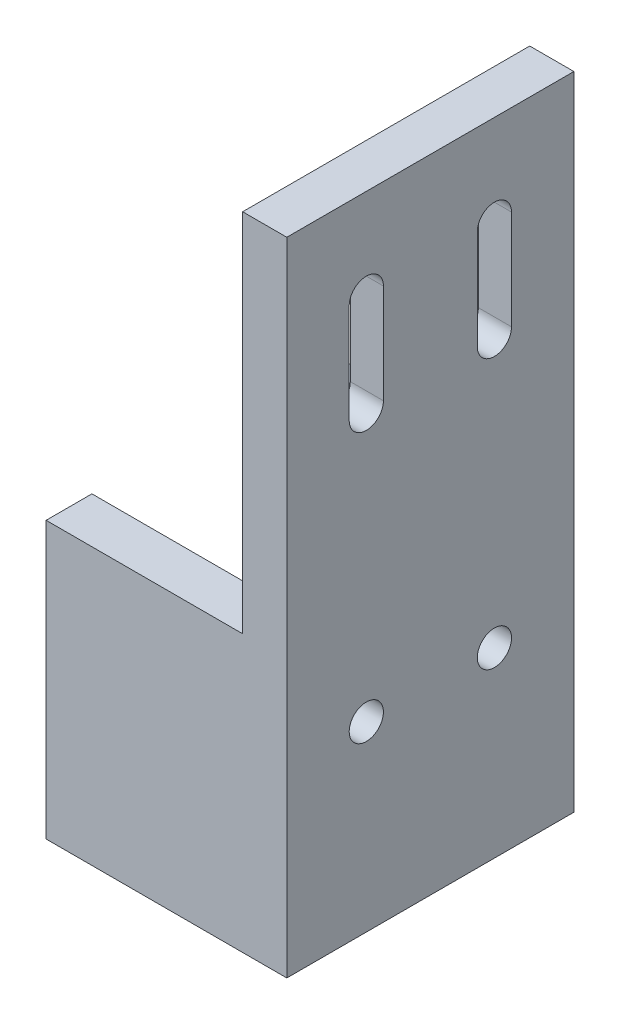
ISO-10303-21;
HEADER;
FILE_DESCRIPTION(('STEP AP214'),'2;1');
FILE_NAME('part.step','',(''),(''),'','','');
FILE_SCHEMA(('AUTOMOTIVE_DESIGN { 1 0 10303 214 1 1 1 1 }'));
ENDSEC;
DATA;
#1=APPLICATION_CONTEXT('core data for automotive mechanical design processes');
#2=APPLICATION_PROTOCOL_DEFINITION('international standard','automotive_design',2000,#1);
#3=PRODUCT_CONTEXT('',#1,'mechanical');
#4=PRODUCT('Part','Part','',(#3));
#5=PRODUCT_RELATED_PRODUCT_CATEGORY('part','',(#4));
#6=PRODUCT_DEFINITION_FORMATION('','',#4);
#7=PRODUCT_DEFINITION_CONTEXT('part definition',#1,'design');
#8=PRODUCT_DEFINITION('design','',#6,#7);
#9=PRODUCT_DEFINITION_SHAPE('','',#8);
#10=(LENGTH_UNIT() NAMED_UNIT(*) SI_UNIT(.MILLI.,.METRE.));
#11=(NAMED_UNIT(*) PLANE_ANGLE_UNIT() SI_UNIT($,.RADIAN.));
#12=(NAMED_UNIT(*) SI_UNIT($,.STERADIAN.) SOLID_ANGLE_UNIT());
#13=UNCERTAINTY_MEASURE_WITH_UNIT(LENGTH_MEASURE(1.E-05),#10,'distance_accuracy_value','');
#14=(GEOMETRIC_REPRESENTATION_CONTEXT(3) GLOBAL_UNCERTAINTY_ASSIGNED_CONTEXT((#13)) GLOBAL_UNIT_ASSIGNED_CONTEXT((#10,
#11,#12)) REPRESENTATION_CONTEXT('',''));
#15=CARTESIAN_POINT('',(0.,0.,0.));
#16=DIRECTION('',(0.,0.,1.));
#17=DIRECTION('',(1.,0.,0.));
#18=AXIS2_PLACEMENT_3D('',#15,#16,#17);
#19=CARTESIAN_POINT('',(0.,58.1,26.));
#20=DIRECTION('',(1.,0.,0.));
#21=DIRECTION('',(0.,1.,0.));
#22=AXIS2_PLACEMENT_3D('',#19,#20,#21);
#23=PLANE('',#22);
#24=DIRECTION('',(0.,-1.,0.));
#25=VECTOR('',#24,1.);
#26=CARTESIAN_POINT('',(0.,49.9,4.));
#27=LINE('',#26,#25);
#28=CARTESIAN_POINT('',(0.,49.9,4.));
#29=VERTEX_POINT('',#28);
#30=CARTESIAN_POINT('',(0.,40.9,4.));
#31=VERTEX_POINT('',#30);
#32=EDGE_CURVE('E380',#29,#31,#27,.T.);
#33=ORIENTED_EDGE('',*,*,#32,.F.);
#34=CARTESIAN_POINT('',(0.,49.9,7.2));
#35=DIRECTION('',(-1.,0.,0.));
#36=DIRECTION('',(0.,-1.,0.));
#37=AXIS2_PLACEMENT_3D('',#34,#35,#36);
#38=CIRCLE('',#37,3.2);
#39=CARTESIAN_POINT('',(0.,49.9,10.4));
#40=VERTEX_POINT('',#39);
#41=EDGE_CURVE('E346',#40,#29,#38,.T.);
#42=ORIENTED_EDGE('',*,*,#41,.F.);
#43=DIRECTION('',(0.,1.,0.));
#44=VECTOR('',#43,1.);
#45=CARTESIAN_POINT('',(0.,49.9,10.4));
#46=LINE('',#45,#44);
#47=CARTESIAN_POINT('',(0.,40.9,10.4));
#48=VERTEX_POINT('',#47);
#49=EDGE_CURVE('E373',#48,#40,#46,.T.);
#50=ORIENTED_EDGE('',*,*,#49,.F.);
#51=CARTESIAN_POINT('',(0.,40.9,7.2));
#52=DIRECTION('',(-1.,0.,0.));
#53=DIRECTION('',(0.,-1.,0.));
#54=AXIS2_PLACEMENT_3D('',#51,#52,#53);
#55=CIRCLE('',#54,3.2);
#56=EDGE_CURVE('E377',#31,#48,#55,.T.);
#57=ORIENTED_EDGE('',*,*,#56,.F.);
#58=EDGE_LOOP('',(#33,#42,#50,#57));
#59=FACE_BOUND('',#58,.T.);
#60=DIRECTION('',(0.,-1.,0.));
#61=VECTOR('',#60,1.);
#62=CARTESIAN_POINT('',(0.,49.9,15.6));
#63=LINE('',#62,#61);
#64=CARTESIAN_POINT('',(0.,49.9,15.6));
#65=VERTEX_POINT('',#64);
#66=CARTESIAN_POINT('',(0.,40.9,15.6));
#67=VERTEX_POINT('',#66);
#68=EDGE_CURVE('E347',#65,#67,#63,.T.);
#69=ORIENTED_EDGE('',*,*,#68,.F.);
#70=CARTESIAN_POINT('',(0.,49.9,18.8));
#71=DIRECTION('',(-1.,0.,0.));
#72=DIRECTION('',(0.,-1.,0.));
#73=AXIS2_PLACEMENT_3D('',#70,#71,#72);
#74=CIRCLE('',#73,3.20000000000001);
#75=CARTESIAN_POINT('',(0.,49.9,22.));
#76=VERTEX_POINT('',#75);
#77=EDGE_CURVE('E344',#76,#65,#74,.T.);
#78=ORIENTED_EDGE('',*,*,#77,.F.);
#79=DIRECTION('',(0.,1.,0.));
#80=VECTOR('',#79,1.);
#81=CARTESIAN_POINT('',(0.,49.9,22.));
#82=LINE('',#81,#80);
#83=CARTESIAN_POINT('',(0.,40.9,22.));
#84=VERTEX_POINT('',#83);
#85=EDGE_CURVE('E333',#84,#76,#82,.T.);
#86=ORIENTED_EDGE('',*,*,#85,.F.);
#87=CARTESIAN_POINT('',(0.,40.9,18.8));
#88=DIRECTION('',(-1.,0.,0.));
#89=DIRECTION('',(0.,-1.,0.));
#90=AXIS2_PLACEMENT_3D('',#87,#88,#89);
#91=CIRCLE('',#90,3.2);
#92=EDGE_CURVE('E350',#67,#84,#91,.T.);
#93=ORIENTED_EDGE('',*,*,#92,.F.);
#94=EDGE_LOOP('',(#69,#78,#86,#93));
#95=FACE_BOUND('',#94,.T.);
#96=CARTESIAN_POINT('',(0.,16.5,7.2));
#97=DIRECTION('',(-1.,0.,0.));
#98=DIRECTION('',(0.,-1.,0.));
#99=AXIS2_PLACEMENT_3D('',#96,#97,#98);
#100=CIRCLE('',#99,1.55);
#101=CARTESIAN_POINT('',(0.,14.95,7.2));
#102=VERTEX_POINT('',#101);
#103=EDGE_CURVE('E285',#102,#102,#100,.T.);
#104=ORIENTED_EDGE('',*,*,#103,.F.);
#105=EDGE_LOOP('',(#104));
#106=FACE_BOUND('',#105,.T.);
#107=CARTESIAN_POINT('',(0.,16.5,18.8));
#108=DIRECTION('',(-1.,0.,0.));
#109=DIRECTION('',(0.,-1.,0.));
#110=AXIS2_PLACEMENT_3D('',#107,#108,#109);
#111=CIRCLE('',#110,1.55);
#112=CARTESIAN_POINT('',(0.,14.95,18.8));
#113=VERTEX_POINT('',#112);
#114=EDGE_CURVE('E286',#113,#113,#111,.T.);
#115=ORIENTED_EDGE('',*,*,#114,.F.);
#116=EDGE_LOOP('',(#115));
#117=FACE_BOUND('',#116,.T.);
#118=DIRECTION('',(0.,0.,-1.));
#119=VECTOR('',#118,1.);
#120=CARTESIAN_POINT('',(0.,25.,26.));
#121=LINE('',#120,#119);
#122=CARTESIAN_POINT('',(0.,25.,26.));
#123=VERTEX_POINT('',#122);
#124=CARTESIAN_POINT('',(0.,25.,21.85));
#125=VERTEX_POINT('',#124);
#126=EDGE_CURVE('E221',#123,#125,#121,.T.);
#127=ORIENTED_EDGE('',*,*,#126,.F.);
#128=DIRECTION('',(0.,-1.,0.));
#129=VECTOR('',#128,1.);
#130=CARTESIAN_POINT('',(0.,58.1,26.));
#131=LINE('',#130,#129);
#132=CARTESIAN_POINT('',(0.,58.1,26.));
#133=VERTEX_POINT('',#132);
#134=EDGE_CURVE('E244',#133,#123,#131,.T.);
#135=ORIENTED_EDGE('',*,*,#134,.F.);
#136=DIRECTION('',(0.,0.,-1.));
#137=VECTOR('',#136,1.);
#138=CARTESIAN_POINT('',(0.,58.1,26.));
#139=LINE('',#138,#137);
#140=CARTESIAN_POINT('',(0.,58.1,0.));
#141=VERTEX_POINT('',#140);
#142=EDGE_CURVE('E239',#133,#141,#139,.T.);
#143=ORIENTED_EDGE('',*,*,#142,.T.);
#144=DIRECTION('',(0.,-1.,0.));
#145=VECTOR('',#144,1.);
#146=CARTESIAN_POINT('',(0.,58.1,0.));
#147=LINE('',#146,#145);
#148=CARTESIAN_POINT('',(0.,25.,0.));
#149=VERTEX_POINT('',#148);
#150=EDGE_CURVE('E60',#141,#149,#147,.T.);
#151=ORIENTED_EDGE('',*,*,#150,.T.);
#152=DIRECTION('',(0.,0.,-1.));
#153=VECTOR('',#152,1.);
#154=CARTESIAN_POINT('',(0.,25.,0.));
#155=LINE('',#154,#153);
#156=CARTESIAN_POINT('',(0.,25.,4.15));
#157=VERTEX_POINT('',#156);
#158=EDGE_CURVE('E402',#157,#149,#155,.T.);
#159=ORIENTED_EDGE('',*,*,#158,.F.);
#160=DIRECTION('',(0.,1.,0.));
#161=VECTOR('',#160,1.);
#162=CARTESIAN_POINT('',(0.,0.,4.15));
#163=LINE('',#162,#161);
#164=CARTESIAN_POINT('',(0.,0.,4.15000000000001));
#165=VERTEX_POINT('',#164);
#166=EDGE_CURVE('E229',#165,#157,#163,.T.);
#167=ORIENTED_EDGE('',*,*,#166,.F.);
#168=DIRECTION('',(0.,0.,-1.));
#169=VECTOR('',#168,1.);
#170=CARTESIAN_POINT('',(0.,0.,26.));
#171=LINE('',#170,#169);
#172=CARTESIAN_POINT('',(0.,0.,21.85));
#173=VERTEX_POINT('',#172);
#174=EDGE_CURVE('E52',#173,#165,#171,.T.);
#175=ORIENTED_EDGE('',*,*,#174,.F.);
#176=DIRECTION('',(0.,-1.,0.));
#177=VECTOR('',#176,1.);
#178=CARTESIAN_POINT('',(0.,0.,21.85));
#179=LINE('',#178,#177);
#180=EDGE_CURVE('E213',#125,#173,#179,.T.);
#181=ORIENTED_EDGE('',*,*,#180,.F.);
#182=EDGE_LOOP('',(#127,#135,#143,#151,#159,#167,#175,#181));
#183=FACE_BOUND('',#182,.T.);
#184=ADVANCED_FACE('F38',(#59,#95,#106,#117,#183),#23,.F.);
#185=CARTESIAN_POINT('',(4.,40.9,7.2));
#186=DIRECTION('',(-1.,0.,0.));
#187=DIRECTION('',(0.,-1.,0.));
#188=AXIS2_PLACEMENT_3D('',#185,#186,#187);
#189=CYLINDRICAL_SURFACE('',#188,1.55);
#190=CARTESIAN_POINT('',(0.999999999999994,40.9,7.2));
#191=DIRECTION('',(-1.,0.,0.));
#192=DIRECTION('',(0.,-1.,0.));
#193=AXIS2_PLACEMENT_3D('',#190,#191,#192);
#194=CIRCLE('',#193,1.55);
#195=CARTESIAN_POINT('',(0.999999999999994,40.9,8.75));
#196=VERTEX_POINT('',#195);
#197=CARTESIAN_POINT('',(0.999999999999994,40.9,5.65));
#198=VERTEX_POINT('',#197);
#199=EDGE_CURVE('E315',#196,#198,#194,.F.);
#200=ORIENTED_EDGE('',*,*,#199,.F.);
#201=DIRECTION('',(-1.,0.,0.));
#202=VECTOR('',#201,1.);
#203=CARTESIAN_POINT('',(4.,40.9,8.75));
#204=LINE('',#203,#202);
#205=CARTESIAN_POINT('',(4.,40.9,8.75));
#206=VERTEX_POINT('',#205);
#207=EDGE_CURVE('E258',#206,#196,#204,.T.);
#208=ORIENTED_EDGE('',*,*,#207,.F.);
#209=CARTESIAN_POINT('',(4.,40.9,7.2));
#210=DIRECTION('',(-1.,0.,0.));
#211=DIRECTION('',(0.,-1.,0.));
#212=AXIS2_PLACEMENT_3D('',#209,#210,#211);
#213=CIRCLE('',#212,1.55);
#214=CARTESIAN_POINT('',(4.,40.9,5.65));
#215=VERTEX_POINT('',#214);
#216=EDGE_CURVE('E278',#215,#206,#213,.T.);
#217=ORIENTED_EDGE('',*,*,#216,.F.);
#218=DIRECTION('',(-1.,0.,0.));
#219=VECTOR('',#218,1.);
#220=CARTESIAN_POINT('',(4.,40.9,5.65));
#221=LINE('',#220,#219);
#222=EDGE_CURVE('E250',#215,#198,#221,.T.);
#223=ORIENTED_EDGE('',*,*,#222,.T.);
#224=EDGE_LOOP('',(#200,#208,#217,#223));
#225=FACE_BOUND('',#224,.T.);
#226=ADVANCED_FACE('F463',(#225),#189,.F.);
#227=CARTESIAN_POINT('',(4.,49.9,5.65));
#228=DIRECTION('',(0.,0.,-1.));
#229=DIRECTION('',(0.,1.,0.));
#230=AXIS2_PLACEMENT_3D('',#227,#228,#229);
#231=PLANE('',#230);
#232=DIRECTION('',(0.,1.,0.));
#233=VECTOR('',#232,1.);
#234=CARTESIAN_POINT('',(0.999999999999993,49.9,5.65));
#235=LINE('',#234,#233);
#236=CARTESIAN_POINT('',(0.999999999999993,49.9,5.65));
#237=VERTEX_POINT('',#236);
#238=EDGE_CURVE('E319',#198,#237,#235,.T.);
#239=ORIENTED_EDGE('',*,*,#238,.F.);
#240=ORIENTED_EDGE('',*,*,#222,.F.);
#241=DIRECTION('',(0.,-1.,0.));
#242=VECTOR('',#241,1.);
#243=CARTESIAN_POINT('',(4.,49.9,5.65));
#244=LINE('',#243,#242);
#245=CARTESIAN_POINT('',(4.,49.9,5.65));
#246=VERTEX_POINT('',#245);
#247=EDGE_CURVE('E262',#246,#215,#244,.T.);
#248=ORIENTED_EDGE('',*,*,#247,.F.);
#249=DIRECTION('',(-1.,0.,0.));
#250=VECTOR('',#249,1.);
#251=CARTESIAN_POINT('',(4.,49.9,5.65));
#252=LINE('',#251,#250);
#253=EDGE_CURVE('E265',#246,#237,#252,.T.);
#254=ORIENTED_EDGE('',*,*,#253,.T.);
#255=EDGE_LOOP('',(#239,#240,#248,#254));
#256=FACE_BOUND('',#255,.T.);
#257=ADVANCED_FACE('F470',(#256),#231,.F.);
#258=CARTESIAN_POINT('',(4.,49.9,7.2));
#259=DIRECTION('',(-1.,0.,0.));
#260=DIRECTION('',(0.,-1.,0.));
#261=AXIS2_PLACEMENT_3D('',#258,#259,#260);
#262=CYLINDRICAL_SURFACE('',#261,1.55);
#263=CARTESIAN_POINT('',(0.999999999999993,49.9,7.2));
#264=DIRECTION('',(-1.,0.,0.));
#265=DIRECTION('',(0.,-1.,0.));
#266=AXIS2_PLACEMENT_3D('',#263,#264,#265);
#267=CIRCLE('',#266,1.55);
#268=CARTESIAN_POINT('',(0.999999999999994,49.9,8.75));
#269=VERTEX_POINT('',#268);
#270=EDGE_CURVE('E321',#237,#269,#267,.F.);
#271=ORIENTED_EDGE('',*,*,#270,.F.);
#272=ORIENTED_EDGE('',*,*,#253,.F.);
#273=CARTESIAN_POINT('',(4.,49.9,7.2));
#274=DIRECTION('',(-1.,0.,0.));
#275=DIRECTION('',(0.,-1.,0.));
#276=AXIS2_PLACEMENT_3D('',#273,#274,#275);
#277=CIRCLE('',#276,1.55);
#278=CARTESIAN_POINT('',(3.99999999999998,49.9,8.75));
#279=VERTEX_POINT('',#278);
#280=EDGE_CURVE('E272',#279,#246,#277,.T.);
#281=ORIENTED_EDGE('',*,*,#280,.F.);
#282=DIRECTION('',(-1.,0.,0.));
#283=VECTOR('',#282,1.);
#284=CARTESIAN_POINT('',(4.,49.9,8.75));
#285=LINE('',#284,#283);
#286=EDGE_CURVE('E261',#279,#269,#285,.T.);
#287=ORIENTED_EDGE('',*,*,#286,.T.);
#288=EDGE_LOOP('',(#271,#272,#281,#287));
#289=FACE_BOUND('',#288,.T.);
#290=ADVANCED_FACE('F522',(#289),#262,.F.);
#291=CARTESIAN_POINT('',(4.,49.9,8.75));
#292=DIRECTION('',(0.,0.,1.));
#293=DIRECTION('',(0.,-1.,0.));
#294=AXIS2_PLACEMENT_3D('',#291,#292,#293);
#295=PLANE('',#294);
#296=DIRECTION('',(0.,-1.,0.));
#297=VECTOR('',#296,1.);
#298=CARTESIAN_POINT('',(0.999999999999993,49.9,8.75));
#299=LINE('',#298,#297);
#300=EDGE_CURVE('E11',#269,#196,#299,.T.);
#301=ORIENTED_EDGE('',*,*,#300,.F.);
#302=ORIENTED_EDGE('',*,*,#286,.F.);
#303=DIRECTION('',(0.,1.,0.));
#304=VECTOR('',#303,1.);
#305=CARTESIAN_POINT('',(4.,49.9,8.75));
#306=LINE('',#305,#304);
#307=EDGE_CURVE('E275',#206,#279,#306,.T.);
#308=ORIENTED_EDGE('',*,*,#307,.F.);
#309=ORIENTED_EDGE('',*,*,#207,.T.);
#310=EDGE_LOOP('',(#301,#302,#308,#309));
#311=FACE_BOUND('',#310,.T.);
#312=ADVANCED_FACE('F507',(#311),#295,.F.);
#313=CARTESIAN_POINT('',(4.,40.9,18.8));
#314=DIRECTION('',(-1.,0.,0.));
#315=DIRECTION('',(0.,-1.,0.));
#316=AXIS2_PLACEMENT_3D('',#313,#314,#315);
#317=CYLINDRICAL_SURFACE('',#316,1.55);
#318=CARTESIAN_POINT('',(0.999999999999994,40.9,18.8));
#319=DIRECTION('',(-1.,0.,0.));
#320=DIRECTION('',(0.,-1.,0.));
#321=AXIS2_PLACEMENT_3D('',#318,#319,#320);
#322=CIRCLE('',#321,1.55);
#323=CARTESIAN_POINT('',(0.999999999999994,40.9,20.35));
#324=VERTEX_POINT('',#323);
#325=CARTESIAN_POINT('',(0.999999999999994,40.9,17.25));
#326=VERTEX_POINT('',#325);
#327=EDGE_CURVE('E323',#324,#326,#322,.F.);
#328=ORIENTED_EDGE('',*,*,#327,.F.);
#329=DIRECTION('',(-1.,0.,0.));
#330=VECTOR('',#329,1.);
#331=CARTESIAN_POINT('',(4.,40.9,20.35));
#332=LINE('',#331,#330);
#333=CARTESIAN_POINT('',(4.,40.9,20.35));
#334=VERTEX_POINT('',#333);
#335=EDGE_CURVE('E301',#334,#324,#332,.T.);
#336=ORIENTED_EDGE('',*,*,#335,.F.);
#337=CARTESIAN_POINT('',(4.,40.9,18.8));
#338=DIRECTION('',(-1.,0.,0.));
#339=DIRECTION('',(0.,-1.,0.));
#340=AXIS2_PLACEMENT_3D('',#337,#338,#339);
#341=CIRCLE('',#340,1.55);
#342=CARTESIAN_POINT('',(4.,40.9,17.25));
#343=VERTEX_POINT('',#342);
#344=EDGE_CURVE('E281',#343,#334,#341,.T.);
#345=ORIENTED_EDGE('',*,*,#344,.F.);
#346=DIRECTION('',(-1.,0.,0.));
#347=VECTOR('',#346,1.);
#348=CARTESIAN_POINT('',(4.,40.9,17.25));
#349=LINE('',#348,#347);
#350=EDGE_CURVE('E289',#343,#326,#349,.T.);
#351=ORIENTED_EDGE('',*,*,#350,.T.);
#352=EDGE_LOOP('',(#328,#336,#345,#351));
#353=FACE_BOUND('',#352,.T.);
#354=ADVANCED_FACE('F503',(#353),#317,.F.);
#355=CARTESIAN_POINT('',(4.,49.9,17.25));
#356=DIRECTION('',(0.,0.,-1.));
#357=DIRECTION('',(0.,1.,0.));
#358=AXIS2_PLACEMENT_3D('',#355,#356,#357);
#359=PLANE('',#358);
#360=DIRECTION('',(0.,1.,0.));
#361=VECTOR('',#360,1.);
#362=CARTESIAN_POINT('',(0.999999999999993,49.9,17.25));
#363=LINE('',#362,#361);
#364=CARTESIAN_POINT('',(0.999999999999993,49.9,17.25));
#365=VERTEX_POINT('',#364);
#366=EDGE_CURVE('E325',#326,#365,#363,.T.);
#367=ORIENTED_EDGE('',*,*,#366,.F.);
#368=ORIENTED_EDGE('',*,*,#350,.F.);
#369=DIRECTION('',(0.,-1.,0.));
#370=VECTOR('',#369,1.);
#371=CARTESIAN_POINT('',(4.,49.9,17.25));
#372=LINE('',#371,#370);
#373=CARTESIAN_POINT('',(4.,49.9,17.25));
#374=VERTEX_POINT('',#373);
#375=EDGE_CURVE('E298',#374,#343,#372,.T.);
#376=ORIENTED_EDGE('',*,*,#375,.F.);
#377=DIRECTION('',(-1.,0.,0.));
#378=VECTOR('',#377,1.);
#379=CARTESIAN_POINT('',(4.,49.9,17.25));
#380=LINE('',#379,#378);
#381=EDGE_CURVE('E304',#374,#365,#380,.T.);
#382=ORIENTED_EDGE('',*,*,#381,.T.);
#383=EDGE_LOOP('',(#367,#368,#376,#382));
#384=FACE_BOUND('',#383,.T.);
#385=ADVANCED_FACE('F506',(#384),#359,.F.);
#386=CARTESIAN_POINT('',(4.,49.9,18.8));
#387=DIRECTION('',(-1.,0.,0.));
#388=DIRECTION('',(0.,-1.,0.));
#389=AXIS2_PLACEMENT_3D('',#386,#387,#388);
#390=CYLINDRICAL_SURFACE('',#389,1.55);
#391=CARTESIAN_POINT('',(0.999999999999993,49.9,18.8));
#392=DIRECTION('',(-1.,0.,0.));
#393=DIRECTION('',(0.,-1.,0.));
#394=AXIS2_PLACEMENT_3D('',#391,#392,#393);
#395=CIRCLE('',#394,1.55);
#396=CARTESIAN_POINT('',(0.999999999999994,49.9,20.35));
#397=VERTEX_POINT('',#396);
#398=EDGE_CURVE('E327',#365,#397,#395,.F.);
#399=ORIENTED_EDGE('',*,*,#398,.F.);
#400=ORIENTED_EDGE('',*,*,#381,.F.);
#401=CARTESIAN_POINT('',(4.,49.9,18.8));
#402=DIRECTION('',(-1.,0.,0.));
#403=DIRECTION('',(0.,-1.,0.));
#404=AXIS2_PLACEMENT_3D('',#401,#402,#403);
#405=CIRCLE('',#404,1.55);
#406=CARTESIAN_POINT('',(3.99999999999998,49.9,20.35));
#407=VERTEX_POINT('',#406);
#408=EDGE_CURVE('E295',#407,#374,#405,.T.);
#409=ORIENTED_EDGE('',*,*,#408,.F.);
#410=DIRECTION('',(-1.,0.,0.));
#411=VECTOR('',#410,1.);
#412=CARTESIAN_POINT('',(4.,49.9,20.35));
#413=LINE('',#412,#411);
#414=EDGE_CURVE('E307',#407,#397,#413,.T.);
#415=ORIENTED_EDGE('',*,*,#414,.T.);
#416=EDGE_LOOP('',(#399,#400,#409,#415));
#417=FACE_BOUND('',#416,.T.);
#418=ADVANCED_FACE('F512',(#417),#390,.F.);
#419=CARTESIAN_POINT('',(4.,49.9,20.35));
#420=DIRECTION('',(0.,0.,1.));
#421=DIRECTION('',(0.,-1.,0.));
#422=AXIS2_PLACEMENT_3D('',#419,#420,#421);
#423=PLANE('',#422);
#424=DIRECTION('',(0.,-1.,0.));
#425=VECTOR('',#424,1.);
#426=CARTESIAN_POINT('',(0.999999999999993,49.9,20.35));
#427=LINE('',#426,#425);
#428=EDGE_CURVE('E45',#397,#324,#427,.T.);
#429=ORIENTED_EDGE('',*,*,#428,.F.);
#430=ORIENTED_EDGE('',*,*,#414,.F.);
#431=DIRECTION('',(0.,1.,0.));
#432=VECTOR('',#431,1.);
#433=CARTESIAN_POINT('',(4.,49.9,20.35));
#434=LINE('',#433,#432);
#435=EDGE_CURVE('E292',#334,#407,#434,.T.);
#436=ORIENTED_EDGE('',*,*,#435,.F.);
#437=ORIENTED_EDGE('',*,*,#335,.T.);
#438=EDGE_LOOP('',(#429,#430,#436,#437));
#439=FACE_BOUND('',#438,.T.);
#440=ADVANCED_FACE('F509',(#439),#423,.F.);
#441=CARTESIAN_POINT('',(0.,0.,26.));
#442=DIRECTION('',(0.,1.,0.));
#443=DIRECTION('',(0.,0.,1.));
#444=AXIS2_PLACEMENT_3D('',#441,#442,#443);
#445=PLANE('',#444);
#446=DIRECTION('',(1.,0.,0.));
#447=VECTOR('',#446,1.);
#448=CARTESIAN_POINT('',(0.,0.,0.));
#449=LINE('',#448,#447);
#450=CARTESIAN_POINT('',(-17.8,0.,0.));
#451=VERTEX_POINT('',#450);
#452=CARTESIAN_POINT('',(3.99999999999999,0.,0.));
#453=VERTEX_POINT('',#452);
#454=EDGE_CURVE('E247',#451,#453,#449,.T.);
#455=ORIENTED_EDGE('',*,*,#454,.T.);
#456=DIRECTION('',(0.,0.,-1.));
#457=VECTOR('',#456,1.);
#458=CARTESIAN_POINT('',(3.99999999999999,0.,26.));
#459=LINE('',#458,#457);
#460=CARTESIAN_POINT('',(3.99999999999999,0.,26.));
#461=VERTEX_POINT('',#460);
#462=EDGE_CURVE('E231',#461,#453,#459,.T.);
#463=ORIENTED_EDGE('',*,*,#462,.F.);
#464=DIRECTION('',(1.,0.,0.));
#465=VECTOR('',#464,1.);
#466=CARTESIAN_POINT('',(0.,0.,26.));
#467=LINE('',#466,#465);
#468=CARTESIAN_POINT('',(-17.8,0.,26.));
#469=VERTEX_POINT('',#468);
#470=EDGE_CURVE('E254',#469,#461,#467,.T.);
#471=ORIENTED_EDGE('',*,*,#470,.F.);
#472=DIRECTION('',(0.,0.,1.));
#473=VECTOR('',#472,1.);
#474=CARTESIAN_POINT('',(-17.8,0.,26.));
#475=LINE('',#474,#473);
#476=CARTESIAN_POINT('',(-17.8,0.,21.85));
#477=VERTEX_POINT('',#476);
#478=EDGE_CURVE('E226',#477,#469,#475,.T.);
#479=ORIENTED_EDGE('',*,*,#478,.F.);
#480=DIRECTION('',(1.,0.,0.));
#481=VECTOR('',#480,1.);
#482=CARTESIAN_POINT('',(-17.8,0.,21.85));
#483=LINE('',#482,#481);
#484=EDGE_CURVE('E216',#477,#173,#483,.T.);
#485=ORIENTED_EDGE('',*,*,#484,.T.);
#486=ORIENTED_EDGE('',*,*,#174,.T.);
#487=DIRECTION('',(1.,0.,0.));
#488=VECTOR('',#487,1.);
#489=CARTESIAN_POINT('',(-17.8,0.,4.15));
#490=LINE('',#489,#488);
#491=CARTESIAN_POINT('',(-17.8,0.,4.15));
#492=VERTEX_POINT('',#491);
#493=EDGE_CURVE('E358',#492,#165,#490,.T.);
#494=ORIENTED_EDGE('',*,*,#493,.F.);
#495=DIRECTION('',(0.,0.,1.));
#496=VECTOR('',#495,1.);
#497=CARTESIAN_POINT('',(-17.8,0.,0.));
#498=LINE('',#497,#496);
#499=EDGE_CURVE('E409',#451,#492,#498,.T.);
#500=ORIENTED_EDGE('',*,*,#499,.F.);
#501=EDGE_LOOP('',(#455,#463,#471,#479,#485,#486,#494,#500));
#502=FACE_BOUND('',#501,.T.);
#503=ADVANCED_FACE('F224',(#502),#445,.F.);
#504=CARTESIAN_POINT('',(3.99999999999999,0.,26.));
#505=DIRECTION('',(-1.,0.,0.));
#506=DIRECTION('',(0.,-1.,0.));
#507=AXIS2_PLACEMENT_3D('',#504,#505,#506);
#508=PLANE('',#507);
#509=ORIENTED_EDGE('',*,*,#375,.T.);
#510=ORIENTED_EDGE('',*,*,#344,.T.);
#511=ORIENTED_EDGE('',*,*,#435,.T.);
#512=ORIENTED_EDGE('',*,*,#408,.T.);
#513=EDGE_LOOP('',(#509,#510,#511,#512));
#514=FACE_BOUND('',#513,.T.);
#515=CARTESIAN_POINT('',(4.,16.5,7.2));
#516=DIRECTION('',(-1.,0.,0.));
#517=DIRECTION('',(0.,-1.,0.));
#518=AXIS2_PLACEMENT_3D('',#515,#516,#517);
#519=CIRCLE('',#518,1.55);
#520=CARTESIAN_POINT('',(4.,14.95,7.2));
#521=VERTEX_POINT('',#520);
#522=EDGE_CURVE('E282',#521,#521,#519,.T.);
#523=ORIENTED_EDGE('',*,*,#522,.T.);
#524=EDGE_LOOP('',(#523));
#525=FACE_BOUND('',#524,.T.);
#526=CARTESIAN_POINT('',(4.,16.5,18.8));
#527=DIRECTION('',(-1.,0.,0.));
#528=DIRECTION('',(0.,-1.,0.));
#529=AXIS2_PLACEMENT_3D('',#526,#527,#528);
#530=CIRCLE('',#529,1.55);
#531=CARTESIAN_POINT('',(4.,14.95,18.8));
#532=VERTEX_POINT('',#531);
#533=EDGE_CURVE('E312',#532,#532,#530,.T.);
#534=ORIENTED_EDGE('',*,*,#533,.T.);
#535=EDGE_LOOP('',(#534));
#536=FACE_BOUND('',#535,.T.);
#537=ORIENTED_EDGE('',*,*,#247,.T.);
#538=ORIENTED_EDGE('',*,*,#216,.T.);
#539=ORIENTED_EDGE('',*,*,#307,.T.);
#540=ORIENTED_EDGE('',*,*,#280,.T.);
#541=EDGE_LOOP('',(#537,#538,#539,#540));
#542=FACE_BOUND('',#541,.T.);
#543=DIRECTION('',(0.,1.,0.));
#544=VECTOR('',#543,1.);
#545=CARTESIAN_POINT('',(3.99999999999999,0.,0.));
#546=LINE('',#545,#544);
#547=CARTESIAN_POINT('',(3.99999999999998,58.1,0.));
#548=VERTEX_POINT('',#547);
#549=EDGE_CURVE('E245',#453,#548,#546,.T.);
#550=ORIENTED_EDGE('',*,*,#549,.T.);
#551=DIRECTION('',(0.,0.,-1.));
#552=VECTOR('',#551,1.);
#553=CARTESIAN_POINT('',(3.99999999999998,58.1,26.));
#554=LINE('',#553,#552);
#555=CARTESIAN_POINT('',(3.99999999999998,58.1,26.));
#556=VERTEX_POINT('',#555);
#557=EDGE_CURVE('E234',#556,#548,#554,.T.);
#558=ORIENTED_EDGE('',*,*,#557,.F.);
#559=DIRECTION('',(0.,1.,0.));
#560=VECTOR('',#559,1.);
#561=CARTESIAN_POINT('',(3.99999999999999,0.,26.));
#562=LINE('',#561,#560);
#563=EDGE_CURVE('E252',#461,#556,#562,.T.);
#564=ORIENTED_EDGE('',*,*,#563,.F.);
#565=ORIENTED_EDGE('',*,*,#462,.T.);
#566=EDGE_LOOP('',(#550,#558,#564,#565));
#567=FACE_BOUND('',#566,.T.);
#568=ADVANCED_FACE('F534',(#514,#525,#536,#542,#567),#508,.F.);
#569=CARTESIAN_POINT('',(3.99999999999998,58.1,26.));
#570=DIRECTION('',(0.,-1.,0.));
#571=DIRECTION('',(0.,0.,-1.));
#572=AXIS2_PLACEMENT_3D('',#569,#570,#571);
#573=PLANE('',#572);
#574=DIRECTION('',(-1.,0.,0.));
#575=VECTOR('',#574,1.);
#576=CARTESIAN_POINT('',(3.99999999999998,58.1,0.));
#577=LINE('',#576,#575);
#578=EDGE_CURVE('E242',#548,#141,#577,.T.);
#579=ORIENTED_EDGE('',*,*,#578,.T.);
#580=ORIENTED_EDGE('',*,*,#142,.F.);
#581=DIRECTION('',(-1.,0.,0.));
#582=VECTOR('',#581,1.);
#583=CARTESIAN_POINT('',(3.99999999999998,58.1,26.));
#584=LINE('',#583,#582);
#585=EDGE_CURVE('E241',#556,#133,#584,.T.);
#586=ORIENTED_EDGE('',*,*,#585,.F.);
#587=ORIENTED_EDGE('',*,*,#557,.T.);
#588=EDGE_LOOP('',(#579,#580,#586,#587));
#589=FACE_BOUND('',#588,.T.);
#590=ADVANCED_FACE('F435',(#589),#573,.F.);
#591=CARTESIAN_POINT('',(0.,0.,26.));
#592=DIRECTION('',(0.,0.,1.));
#593=DIRECTION('',(1.,0.,0.));
#594=AXIS2_PLACEMENT_3D('',#591,#592,#593);
#595=PLANE('',#594);
#596=ORIENTED_EDGE('',*,*,#134,.T.);
#597=DIRECTION('',(1.,0.,0.));
#598=VECTOR('',#597,1.);
#599=CARTESIAN_POINT('',(-17.8,25.,26.));
#600=LINE('',#599,#598);
#601=CARTESIAN_POINT('',(-17.8,25.,26.));
#602=VERTEX_POINT('',#601);
#603=EDGE_CURVE('E422',#602,#123,#600,.T.);
#604=ORIENTED_EDGE('',*,*,#603,.F.);
#605=DIRECTION('',(0.,1.,0.));
#606=VECTOR('',#605,1.);
#607=CARTESIAN_POINT('',(-17.8,0.,26.));
#608=LINE('',#607,#606);
#609=EDGE_CURVE('E222',#469,#602,#608,.T.);
#610=ORIENTED_EDGE('',*,*,#609,.F.);
#611=ORIENTED_EDGE('',*,*,#470,.T.);
#612=ORIENTED_EDGE('',*,*,#563,.T.);
#613=ORIENTED_EDGE('',*,*,#585,.T.);
#614=EDGE_LOOP('',(#596,#604,#610,#611,#612,#613));
#615=FACE_BOUND('',#614,.T.);
#616=ADVANCED_FACE('F429',(#615),#595,.T.);
#617=CARTESIAN_POINT('',(0.,0.,0.));
#618=DIRECTION('',(0.,0.,1.));
#619=DIRECTION('',(1.,0.,0.));
#620=AXIS2_PLACEMENT_3D('',#617,#618,#619);
#621=PLANE('',#620);
#622=ORIENTED_EDGE('',*,*,#150,.F.);
#623=ORIENTED_EDGE('',*,*,#578,.F.);
#624=ORIENTED_EDGE('',*,*,#549,.F.);
#625=ORIENTED_EDGE('',*,*,#454,.F.);
#626=DIRECTION('',(0.,-1.,0.));
#627=VECTOR('',#626,1.);
#628=CARTESIAN_POINT('',(-17.8,0.,0.));
#629=LINE('',#628,#627);
#630=CARTESIAN_POINT('',(-17.8,25.,0.));
#631=VERTEX_POINT('',#630);
#632=EDGE_CURVE('E404',#631,#451,#629,.T.);
#633=ORIENTED_EDGE('',*,*,#632,.F.);
#634=DIRECTION('',(1.,0.,0.));
#635=VECTOR('',#634,1.);
#636=CARTESIAN_POINT('',(-17.8,25.,0.));
#637=LINE('',#636,#635);
#638=EDGE_CURVE('E398',#631,#149,#637,.T.);
#639=ORIENTED_EDGE('',*,*,#638,.T.);
#640=EDGE_LOOP('',(#622,#623,#624,#625,#633,#639));
#641=FACE_BOUND('',#640,.T.);
#642=ADVANCED_FACE('F438',(#641),#621,.F.);
#643=CARTESIAN_POINT('',(4.,16.5,18.8));
#644=DIRECTION('',(-1.,0.,0.));
#645=DIRECTION('',(0.,-1.,0.));
#646=AXIS2_PLACEMENT_3D('',#643,#644,#645);
#647=CYLINDRICAL_SURFACE('',#646,1.55);
#648=ORIENTED_EDGE('',*,*,#533,.F.);
#649=EDGE_LOOP('',(#648));
#650=FACE_BOUND('',#649,.T.);
#651=ORIENTED_EDGE('',*,*,#114,.T.);
#652=EDGE_LOOP('',(#651));
#653=FACE_BOUND('',#652,.T.);
#654=ADVANCED_FACE('F485',(#650,#653),#647,.F.);
#655=CARTESIAN_POINT('',(4.,16.5,7.2));
#656=DIRECTION('',(-1.,0.,0.));
#657=DIRECTION('',(0.,-1.,0.));
#658=AXIS2_PLACEMENT_3D('',#655,#656,#657);
#659=CYLINDRICAL_SURFACE('',#658,1.55);
#660=ORIENTED_EDGE('',*,*,#522,.F.);
#661=EDGE_LOOP('',(#660));
#662=FACE_BOUND('',#661,.T.);
#663=ORIENTED_EDGE('',*,*,#103,.T.);
#664=EDGE_LOOP('',(#663));
#665=FACE_BOUND('',#664,.T.);
#666=ADVANCED_FACE('F487',(#662,#665),#659,.F.);
#667=CARTESIAN_POINT('',(0.999999999999993,49.9,18.8));
#668=DIRECTION('',(-1.,0.,0.));
#669=DIRECTION('',(0.,-1.,0.));
#670=AXIS2_PLACEMENT_3D('',#667,#668,#669);
#671=PLANE('',#670);
#672=CARTESIAN_POINT('',(0.999999999999993,49.9,18.8));
#673=DIRECTION('',(-1.,0.,0.));
#674=DIRECTION('',(0.,-1.,0.));
#675=AXIS2_PLACEMENT_3D('',#672,#673,#674);
#676=CIRCLE('',#675,3.20000000000001);
#677=CARTESIAN_POINT('',(0.999999999999993,49.9,22.));
#678=VERTEX_POINT('',#677);
#679=CARTESIAN_POINT('',(0.999999999999993,49.9,15.6));
#680=VERTEX_POINT('',#679);
#681=EDGE_CURVE('E330',#678,#680,#676,.T.);
#682=ORIENTED_EDGE('',*,*,#681,.T.);
#683=DIRECTION('',(0.,-1.,0.));
#684=VECTOR('',#683,1.);
#685=CARTESIAN_POINT('',(0.999999999999993,49.9,15.6));
#686=LINE('',#685,#684);
#687=CARTESIAN_POINT('',(0.999999999999994,40.9,15.6));
#688=VERTEX_POINT('',#687);
#689=EDGE_CURVE('E334',#680,#688,#686,.T.);
#690=ORIENTED_EDGE('',*,*,#689,.T.);
#691=CARTESIAN_POINT('',(0.999999999999994,40.9,18.8));
#692=DIRECTION('',(-1.,0.,0.));
#693=DIRECTION('',(0.,-1.,0.));
#694=AXIS2_PLACEMENT_3D('',#691,#692,#693);
#695=CIRCLE('',#694,3.2);
#696=CARTESIAN_POINT('',(0.999999999999994,40.9,22.));
#697=VERTEX_POINT('',#696);
#698=EDGE_CURVE('E337',#688,#697,#695,.T.);
#699=ORIENTED_EDGE('',*,*,#698,.T.);
#700=DIRECTION('',(0.,1.,0.));
#701=VECTOR('',#700,1.);
#702=CARTESIAN_POINT('',(0.999999999999993,49.9,22.));
#703=LINE('',#702,#701);
#704=EDGE_CURVE('E340',#697,#678,#703,.T.);
#705=ORIENTED_EDGE('',*,*,#704,.T.);
#706=EDGE_LOOP('',(#682,#690,#699,#705));
#707=FACE_BOUND('',#706,.T.);
#708=ORIENTED_EDGE('',*,*,#327,.T.);
#709=ORIENTED_EDGE('',*,*,#366,.T.);
#710=ORIENTED_EDGE('',*,*,#398,.T.);
#711=ORIENTED_EDGE('',*,*,#428,.T.);
#712=EDGE_LOOP('',(#708,#709,#710,#711));
#713=FACE_BOUND('',#712,.T.);
#714=ADVANCED_FACE('F494',(#707,#713),#671,.T.);
#715=CARTESIAN_POINT('',(0.999999999999993,49.9,18.8));
#716=DIRECTION('',(-1.,0.,0.));
#717=DIRECTION('',(0.,-1.,0.));
#718=AXIS2_PLACEMENT_3D('',#715,#716,#717);
#719=CYLINDRICAL_SURFACE('',#718,3.20000000000001);
#720=ORIENTED_EDGE('',*,*,#77,.T.);
#721=DIRECTION('',(-1.,0.,0.));
#722=VECTOR('',#721,1.);
#723=CARTESIAN_POINT('',(0.999999999999993,49.9,15.6));
#724=LINE('',#723,#722);
#725=EDGE_CURVE('E343',#680,#65,#724,.T.);
#726=ORIENTED_EDGE('',*,*,#725,.F.);
#727=ORIENTED_EDGE('',*,*,#681,.F.);
#728=DIRECTION('',(-1.,0.,0.));
#729=VECTOR('',#728,1.);
#730=CARTESIAN_POINT('',(0.999999999999993,49.9,22.));
#731=LINE('',#730,#729);
#732=EDGE_CURVE('E355',#678,#76,#731,.T.);
#733=ORIENTED_EDGE('',*,*,#732,.T.);
#734=EDGE_LOOP('',(#720,#726,#727,#733));
#735=FACE_BOUND('',#734,.T.);
#736=ADVANCED_FACE('F665',(#735),#719,.F.);
#737=CARTESIAN_POINT('',(0.999999999999993,49.9,22.));
#738=DIRECTION('',(0.,0.,1.));
#739=DIRECTION('',(1.,0.,0.));
#740=AXIS2_PLACEMENT_3D('',#737,#738,#739);
#741=PLANE('',#740);
#742=ORIENTED_EDGE('',*,*,#85,.T.);
#743=ORIENTED_EDGE('',*,*,#732,.F.);
#744=ORIENTED_EDGE('',*,*,#704,.F.);
#745=DIRECTION('',(-1.,0.,0.));
#746=VECTOR('',#745,1.);
#747=CARTESIAN_POINT('',(0.999999999999994,40.9,22.));
#748=LINE('',#747,#746);
#749=EDGE_CURVE('E357',#697,#84,#748,.T.);
#750=ORIENTED_EDGE('',*,*,#749,.T.);
#751=EDGE_LOOP('',(#742,#743,#744,#750));
#752=FACE_BOUND('',#751,.T.);
#753=ADVANCED_FACE('F656',(#752),#741,.F.);
#754=CARTESIAN_POINT('',(0.999999999999994,40.9,18.8));
#755=DIRECTION('',(-1.,0.,0.));
#756=DIRECTION('',(0.,-1.,0.));
#757=AXIS2_PLACEMENT_3D('',#754,#755,#756);
#758=CYLINDRICAL_SURFACE('',#757,3.2);
#759=ORIENTED_EDGE('',*,*,#92,.T.);
#760=ORIENTED_EDGE('',*,*,#749,.F.);
#761=ORIENTED_EDGE('',*,*,#698,.F.);
#762=DIRECTION('',(-1.,0.,0.));
#763=VECTOR('',#762,1.);
#764=CARTESIAN_POINT('',(0.999999999999994,40.9,15.6));
#765=LINE('',#764,#763);
#766=EDGE_CURVE('E360',#688,#67,#765,.T.);
#767=ORIENTED_EDGE('',*,*,#766,.T.);
#768=EDGE_LOOP('',(#759,#760,#761,#767));
#769=FACE_BOUND('',#768,.T.);
#770=ADVANCED_FACE('F647',(#769),#758,.F.);
#771=CARTESIAN_POINT('',(0.999999999999993,49.9,15.6));
#772=DIRECTION('',(0.,0.,-1.));
#773=DIRECTION('',(0.,1.,0.));
#774=AXIS2_PLACEMENT_3D('',#771,#772,#773);
#775=PLANE('',#774);
#776=ORIENTED_EDGE('',*,*,#68,.T.);
#777=ORIENTED_EDGE('',*,*,#766,.F.);
#778=ORIENTED_EDGE('',*,*,#689,.F.);
#779=ORIENTED_EDGE('',*,*,#725,.T.);
#780=EDGE_LOOP('',(#776,#777,#778,#779));
#781=FACE_BOUND('',#780,.T.);
#782=ADVANCED_FACE('F638',(#781),#775,.F.);
#783=CARTESIAN_POINT('',(0.999999999999993,49.9,7.2));
#784=DIRECTION('',(-1.,0.,0.));
#785=DIRECTION('',(0.,-1.,0.));
#786=AXIS2_PLACEMENT_3D('',#783,#784,#785);
#787=PLANE('',#786);
#788=CARTESIAN_POINT('',(0.999999999999993,49.9,7.2));
#789=DIRECTION('',(-1.,0.,0.));
#790=DIRECTION('',(0.,-1.,0.));
#791=AXIS2_PLACEMENT_3D('',#788,#789,#790);
#792=CIRCLE('',#791,3.2);
#793=CARTESIAN_POINT('',(0.999999999999993,49.9,10.4));
#794=VERTEX_POINT('',#793);
#795=CARTESIAN_POINT('',(0.999999999999993,49.9,4.));
#796=VERTEX_POINT('',#795);
#797=EDGE_CURVE('E376',#794,#796,#792,.T.);
#798=ORIENTED_EDGE('',*,*,#797,.T.);
#799=DIRECTION('',(0.,-1.,0.));
#800=VECTOR('',#799,1.);
#801=CARTESIAN_POINT('',(0.999999999999993,49.9,4.));
#802=LINE('',#801,#800);
#803=CARTESIAN_POINT('',(0.999999999999994,40.9,4.));
#804=VERTEX_POINT('',#803);
#805=EDGE_CURVE('E389',#796,#804,#802,.T.);
#806=ORIENTED_EDGE('',*,*,#805,.T.);
#807=CARTESIAN_POINT('',(0.999999999999994,40.9,7.2));
#808=DIRECTION('',(-1.,0.,0.));
#809=DIRECTION('',(0.,-1.,0.));
#810=AXIS2_PLACEMENT_3D('',#807,#808,#809);
#811=CIRCLE('',#810,3.2);
#812=CARTESIAN_POINT('',(0.999999999999994,40.9,10.4));
#813=VERTEX_POINT('',#812);
#814=EDGE_CURVE('E386',#804,#813,#811,.T.);
#815=ORIENTED_EDGE('',*,*,#814,.T.);
#816=DIRECTION('',(0.,1.,0.));
#817=VECTOR('',#816,1.);
#818=CARTESIAN_POINT('',(0.999999999999993,49.9,10.4));
#819=LINE('',#818,#817);
#820=EDGE_CURVE('E368',#813,#794,#819,.T.);
#821=ORIENTED_EDGE('',*,*,#820,.T.);
#822=EDGE_LOOP('',(#798,#806,#815,#821));
#823=FACE_BOUND('',#822,.T.);
#824=ORIENTED_EDGE('',*,*,#199,.T.);
#825=ORIENTED_EDGE('',*,*,#238,.T.);
#826=ORIENTED_EDGE('',*,*,#270,.T.);
#827=ORIENTED_EDGE('',*,*,#300,.T.);
#828=EDGE_LOOP('',(#824,#825,#826,#827));
#829=FACE_BOUND('',#828,.T.);
#830=ADVANCED_FACE('F629',(#823,#829),#787,.T.);
#831=CARTESIAN_POINT('',(0.999999999999993,49.9,7.2));
#832=DIRECTION('',(-1.,0.,0.));
#833=DIRECTION('',(0.,-1.,0.));
#834=AXIS2_PLACEMENT_3D('',#831,#832,#833);
#835=CYLINDRICAL_SURFACE('',#834,3.2);
#836=ORIENTED_EDGE('',*,*,#41,.T.);
#837=DIRECTION('',(-1.,0.,0.));
#838=VECTOR('',#837,1.);
#839=CARTESIAN_POINT('',(0.999999999999993,49.9,4.));
#840=LINE('',#839,#838);
#841=EDGE_CURVE('E364',#796,#29,#840,.T.);
#842=ORIENTED_EDGE('',*,*,#841,.F.);
#843=ORIENTED_EDGE('',*,*,#797,.F.);
#844=DIRECTION('',(-1.,0.,0.));
#845=VECTOR('',#844,1.);
#846=CARTESIAN_POINT('',(0.999999999999993,49.9,10.4));
#847=LINE('',#846,#845);
#848=EDGE_CURVE('E329',#794,#40,#847,.T.);
#849=ORIENTED_EDGE('',*,*,#848,.T.);
#850=EDGE_LOOP('',(#836,#842,#843,#849));
#851=FACE_BOUND('',#850,.T.);
#852=ADVANCED_FACE('F620',(#851),#835,.F.);
#853=CARTESIAN_POINT('',(0.999999999999993,49.9,10.4));
#854=DIRECTION('',(0.,0.,1.));
#855=DIRECTION('',(1.,0.,0.));
#856=AXIS2_PLACEMENT_3D('',#853,#854,#855);
#857=PLANE('',#856);
#858=ORIENTED_EDGE('',*,*,#49,.T.);
#859=ORIENTED_EDGE('',*,*,#848,.F.);
#860=ORIENTED_EDGE('',*,*,#820,.F.);
#861=DIRECTION('',(-1.,0.,0.));
#862=VECTOR('',#861,1.);
#863=CARTESIAN_POINT('',(0.999999999999994,40.9,10.4));
#864=LINE('',#863,#862);
#865=EDGE_CURVE('E370',#813,#48,#864,.T.);
#866=ORIENTED_EDGE('',*,*,#865,.T.);
#867=EDGE_LOOP('',(#858,#859,#860,#866));
#868=FACE_BOUND('',#867,.T.);
#869=ADVANCED_FACE('F611',(#868),#857,.F.);
#870=CARTESIAN_POINT('',(0.999999999999994,40.9,7.2));
#871=DIRECTION('',(-1.,0.,0.));
#872=DIRECTION('',(0.,-1.,0.));
#873=AXIS2_PLACEMENT_3D('',#870,#871,#872);
#874=CYLINDRICAL_SURFACE('',#873,3.2);
#875=ORIENTED_EDGE('',*,*,#56,.T.);
#876=ORIENTED_EDGE('',*,*,#865,.F.);
#877=ORIENTED_EDGE('',*,*,#814,.F.);
#878=DIRECTION('',(-1.,0.,0.));
#879=VECTOR('',#878,1.);
#880=CARTESIAN_POINT('',(0.999999999999994,40.9,4.));
#881=LINE('',#880,#879);
#882=EDGE_CURVE('E367',#804,#31,#881,.T.);
#883=ORIENTED_EDGE('',*,*,#882,.T.);
#884=EDGE_LOOP('',(#875,#876,#877,#883));
#885=FACE_BOUND('',#884,.T.);
#886=ADVANCED_FACE('F602',(#885),#874,.F.);
#887=CARTESIAN_POINT('',(0.999999999999993,49.9,4.));
#888=DIRECTION('',(0.,0.,-1.));
#889=DIRECTION('',(0.,1.,0.));
#890=AXIS2_PLACEMENT_3D('',#887,#888,#889);
#891=PLANE('',#890);
#892=ORIENTED_EDGE('',*,*,#32,.T.);
#893=ORIENTED_EDGE('',*,*,#882,.F.);
#894=ORIENTED_EDGE('',*,*,#805,.F.);
#895=ORIENTED_EDGE('',*,*,#841,.T.);
#896=EDGE_LOOP('',(#892,#893,#894,#895));
#897=FACE_BOUND('',#896,.T.);
#898=ADVANCED_FACE('F554',(#897),#891,.F.);
#899=CARTESIAN_POINT('',(-17.8,0.,4.15));
#900=DIRECTION('',(0.,0.,-1.));
#901=DIRECTION('',(0.,1.,0.));
#902=AXIS2_PLACEMENT_3D('',#899,#900,#901);
#903=PLANE('',#902);
#904=ORIENTED_EDGE('',*,*,#166,.T.);
#905=DIRECTION('',(1.,0.,0.));
#906=VECTOR('',#905,1.);
#907=CARTESIAN_POINT('',(-17.8,25.,4.15));
#908=LINE('',#907,#906);
#909=CARTESIAN_POINT('',(-17.8,25.,4.15));
#910=VERTEX_POINT('',#909);
#911=EDGE_CURVE('E395',#910,#157,#908,.T.);
#912=ORIENTED_EDGE('',*,*,#911,.F.);
#913=DIRECTION('',(0.,1.,0.));
#914=VECTOR('',#913,1.);
#915=CARTESIAN_POINT('',(-17.8,0.,4.15));
#916=LINE('',#915,#914);
#917=EDGE_CURVE('E407',#492,#910,#916,.T.);
#918=ORIENTED_EDGE('',*,*,#917,.F.);
#919=ORIENTED_EDGE('',*,*,#493,.T.);
#920=EDGE_LOOP('',(#904,#912,#918,#919));
#921=FACE_BOUND('',#920,.T.);
#922=ADVANCED_FACE('F447',(#921),#903,.F.);
#923=CARTESIAN_POINT('',(-17.8,25.,0.));
#924=DIRECTION('',(0.,-1.,0.));
#925=DIRECTION('',(1.,0.,0.));
#926=AXIS2_PLACEMENT_3D('',#923,#924,#925);
#927=PLANE('',#926);
#928=ORIENTED_EDGE('',*,*,#158,.T.);
#929=ORIENTED_EDGE('',*,*,#638,.F.);
#930=DIRECTION('',(0.,0.,-1.));
#931=VECTOR('',#930,1.);
#932=CARTESIAN_POINT('',(-17.8,25.,0.));
#933=LINE('',#932,#931);
#934=EDGE_CURVE('E401',#910,#631,#933,.T.);
#935=ORIENTED_EDGE('',*,*,#934,.F.);
#936=ORIENTED_EDGE('',*,*,#911,.T.);
#937=EDGE_LOOP('',(#928,#929,#935,#936));
#938=FACE_BOUND('',#937,.T.);
#939=ADVANCED_FACE('F444',(#938),#927,.F.);
#940=CARTESIAN_POINT('',(-17.8,0.,0.));
#941=DIRECTION('',(1.,0.,0.));
#942=DIRECTION('',(0.,1.,0.));
#943=AXIS2_PLACEMENT_3D('',#940,#941,#942);
#944=PLANE('',#943);
#945=ORIENTED_EDGE('',*,*,#632,.T.);
#946=ORIENTED_EDGE('',*,*,#499,.T.);
#947=ORIENTED_EDGE('',*,*,#917,.T.);
#948=ORIENTED_EDGE('',*,*,#934,.T.);
#949=EDGE_LOOP('',(#945,#946,#947,#948));
#950=FACE_BOUND('',#949,.T.);
#951=ADVANCED_FACE('F452',(#950),#944,.F.);
#952=CARTESIAN_POINT('',(-17.8,25.,26.));
#953=DIRECTION('',(0.,-1.,0.));
#954=DIRECTION('',(1.,0.,0.));
#955=AXIS2_PLACEMENT_3D('',#952,#953,#954);
#956=PLANE('',#955);
#957=ORIENTED_EDGE('',*,*,#126,.T.);
#958=DIRECTION('',(1.,0.,0.));
#959=VECTOR('',#958,1.);
#960=CARTESIAN_POINT('',(-17.8,25.,21.85));
#961=LINE('',#960,#959);
#962=CARTESIAN_POINT('',(-17.8,25.,21.85));
#963=VERTEX_POINT('',#962);
#964=EDGE_CURVE('E219',#963,#125,#961,.T.);
#965=ORIENTED_EDGE('',*,*,#964,.F.);
#966=DIRECTION('',(0.,0.,-1.));
#967=VECTOR('',#966,1.);
#968=CARTESIAN_POINT('',(-17.8,25.,26.));
#969=LINE('',#968,#967);
#970=EDGE_CURVE('E415',#602,#963,#969,.T.);
#971=ORIENTED_EDGE('',*,*,#970,.F.);
#972=ORIENTED_EDGE('',*,*,#603,.T.);
#973=EDGE_LOOP('',(#957,#965,#971,#972));
#974=FACE_BOUND('',#973,.T.);
#975=ADVANCED_FACE('F425',(#974),#956,.F.);
#976=CARTESIAN_POINT('',(-17.8,0.,21.85));
#977=DIRECTION('',(0.,0.,1.));
#978=DIRECTION('',(1.,0.,0.));
#979=AXIS2_PLACEMENT_3D('',#976,#977,#978);
#980=PLANE('',#979);
#981=ORIENTED_EDGE('',*,*,#180,.T.);
#982=ORIENTED_EDGE('',*,*,#484,.F.);
#983=DIRECTION('',(0.,-1.,0.));
#984=VECTOR('',#983,1.);
#985=CARTESIAN_POINT('',(-17.8,0.,21.85));
#986=LINE('',#985,#984);
#987=EDGE_CURVE('E417',#963,#477,#986,.T.);
#988=ORIENTED_EDGE('',*,*,#987,.F.);
#989=ORIENTED_EDGE('',*,*,#964,.T.);
#990=EDGE_LOOP('',(#981,#982,#988,#989));
#991=FACE_BOUND('',#990,.T.);
#992=ADVANCED_FACE('F214',(#991),#980,.F.);
#993=CARTESIAN_POINT('',(-17.8,0.,0.));
#994=DIRECTION('',(-1.,0.,0.));
#995=DIRECTION('',(0.,-1.,0.));
#996=AXIS2_PLACEMENT_3D('',#993,#994,#995);
#997=PLANE('',#996);
#998=ORIENTED_EDGE('',*,*,#609,.T.);
#999=ORIENTED_EDGE('',*,*,#970,.T.);
#1000=ORIENTED_EDGE('',*,*,#987,.T.);
#1001=ORIENTED_EDGE('',*,*,#478,.T.);
#1002=EDGE_LOOP('',(#998,#999,#1000,#1001));
#1003=FACE_BOUND('',#1002,.T.);
#1004=ADVANCED_FACE('F581',(#1003),#997,.T.);
#1005=CLOSED_SHELL('',(#184,#226,#257,#290,#312,#354,#385,#418,#440,#503,#568,#590,#616,#642,
#654,#666,#714,#736,#753,#770,#782,#830,#852,#869,#886,#898,#922,#939,#951,#975,#992,#1004));
#1006=MANIFOLD_SOLID_BREP('B2',#1005);
#1007=ADVANCED_BREP_SHAPE_REPRESENTATION('',(#18,#1006),#14);
#1008=SHAPE_DEFINITION_REPRESENTATION(#9,#1007);
ENDSEC;
END-ISO-10303-21;
